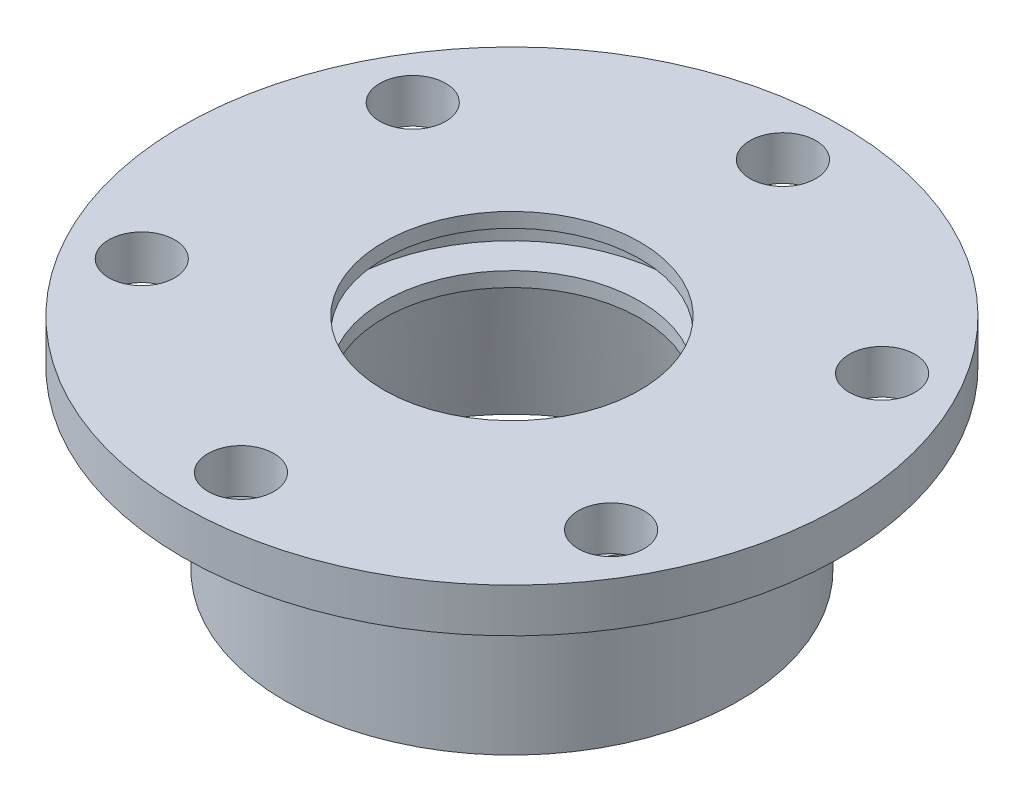
ISO-10303-21;
HEADER;
FILE_DESCRIPTION(('STEP AP214'),'2;1');
FILE_NAME('part.step','',(''),(''),'','','');
FILE_SCHEMA(('AUTOMOTIVE_DESIGN { 1 0 10303 214 1 1 1 1 }'));
ENDSEC;
DATA;
#1=APPLICATION_CONTEXT('core data for automotive mechanical design processes');
#2=APPLICATION_PROTOCOL_DEFINITION('international standard','automotive_design',2000,#1);
#3=PRODUCT_CONTEXT('',#1,'mechanical');
#4=PRODUCT('Part','Part','',(#3));
#5=PRODUCT_RELATED_PRODUCT_CATEGORY('part','',(#4));
#6=PRODUCT_DEFINITION_FORMATION('','',#4);
#7=PRODUCT_DEFINITION_CONTEXT('part definition',#1,'design');
#8=PRODUCT_DEFINITION('design','',#6,#7);
#9=PRODUCT_DEFINITION_SHAPE('','',#8);
#10=(LENGTH_UNIT() NAMED_UNIT(*) SI_UNIT(.MILLI.,.METRE.));
#11=(NAMED_UNIT(*) PLANE_ANGLE_UNIT() SI_UNIT($,.RADIAN.));
#12=(NAMED_UNIT(*) SI_UNIT($,.STERADIAN.) SOLID_ANGLE_UNIT());
#13=UNCERTAINTY_MEASURE_WITH_UNIT(LENGTH_MEASURE(1.E-05),#10,'distance_accuracy_value','');
#14=(GEOMETRIC_REPRESENTATION_CONTEXT(3) GLOBAL_UNCERTAINTY_ASSIGNED_CONTEXT((#13)) GLOBAL_UNIT_ASSIGNED_CONTEXT((#10,
#11,#12)) REPRESENTATION_CONTEXT('',''));
#15=CARTESIAN_POINT('',(0.,0.,0.));
#16=DIRECTION('',(0.,0.,1.));
#17=DIRECTION('',(1.,0.,0.));
#18=AXIS2_PLACEMENT_3D('',#15,#16,#17);
#19=CARTESIAN_POINT('',(-27.,30.,0.));
#20=DIRECTION('',(0.,1.,0.));
#21=DIRECTION('',(0.,0.,1.));
#22=AXIS2_PLACEMENT_3D('',#19,#20,#21);
#23=PLANE('',#22);
#24=CARTESIAN_POINT('',(0.,30.,-37.));
#25=DIRECTION('',(0.,1.,0.));
#26=DIRECTION('',(0.,0.,1.));
#27=AXIS2_PLACEMENT_3D('',#24,#25,#26);
#28=CIRCLE('',#27,4.5);
#29=CARTESIAN_POINT('',(0.,30.,-32.5));
#30=VERTEX_POINT('',#29);
#31=EDGE_CURVE('E79',#30,#30,#28,.T.);
#32=ORIENTED_EDGE('',*,*,#31,.F.);
#33=EDGE_LOOP('',(#32));
#34=FACE_BOUND('',#33,.T.);
#35=CARTESIAN_POINT('',(-32.0429399400232,30.,-18.4999999999982));
#36=DIRECTION('',(0.,1.,0.));
#37=DIRECTION('',(0.,0.,1.));
#38=AXIS2_PLACEMENT_3D('',#35,#36,#37);
#39=CIRCLE('',#38,4.50000000000197);
#40=CARTESIAN_POINT('',(-32.0429399400232,30.,-13.9999999999962));
#41=VERTEX_POINT('',#40);
#42=EDGE_CURVE('E84',#41,#41,#39,.T.);
#43=ORIENTED_EDGE('',*,*,#42,.F.);
#44=EDGE_LOOP('',(#43));
#45=FACE_BOUND('',#44,.T.);
#46=CARTESIAN_POINT('',(-32.0429399400211,30.,18.5000000000018));
#47=DIRECTION('',(0.,1.,0.));
#48=DIRECTION('',(0.,0.,1.));
#49=AXIS2_PLACEMENT_3D('',#46,#47,#48);
#50=CIRCLE('',#49,4.5000000000039);
#51=CARTESIAN_POINT('',(-32.0429399400211,30.,23.0000000000057));
#52=VERTEX_POINT('',#51);
#53=EDGE_CURVE('E83',#52,#52,#50,.T.);
#54=ORIENTED_EDGE('',*,*,#53,.F.);
#55=EDGE_LOOP('',(#54));
#56=FACE_BOUND('',#55,.T.);
#57=CARTESIAN_POINT('',(4.1990728836402E-12,30.,37.));
#58=DIRECTION('',(0.,1.,0.));
#59=DIRECTION('',(0.,0.,1.));
#60=AXIS2_PLACEMENT_3D('',#57,#58,#59);
#61=CIRCLE('',#60,4.50000000000426);
#62=CARTESIAN_POINT('',(4.1990728836402E-12,30.,41.5000000000043));
#63=VERTEX_POINT('',#62);
#64=EDGE_CURVE('E90',#63,#63,#61,.T.);
#65=ORIENTED_EDGE('',*,*,#64,.F.);
#66=EDGE_LOOP('',(#65));
#67=FACE_BOUND('',#66,.T.);
#68=CARTESIAN_POINT('',(32.0429399400274,30.,18.4999999999982));
#69=DIRECTION('',(0.,1.,0.));
#70=DIRECTION('',(0.,0.,1.));
#71=AXIS2_PLACEMENT_3D('',#68,#69,#70);
#72=CIRCLE('',#71,4.50000000000265);
#73=CARTESIAN_POINT('',(32.0429399400274,30.,23.0000000000008));
#74=VERTEX_POINT('',#73);
#75=EDGE_CURVE('E96',#74,#74,#72,.T.);
#76=ORIENTED_EDGE('',*,*,#75,.F.);
#77=EDGE_LOOP('',(#76));
#78=FACE_BOUND('',#77,.T.);
#79=CARTESIAN_POINT('',(32.0429399400253,30.,-18.5000000000018));
#80=DIRECTION('',(0.,1.,0.));
#81=DIRECTION('',(0.,0.,1.));
#82=AXIS2_PLACEMENT_3D('',#79,#80,#81);
#83=CIRCLE('',#82,4.50000000000057);
#84=CARTESIAN_POINT('',(32.0429399400253,30.,-14.0000000000013));
#85=VERTEX_POINT('',#84);
#86=EDGE_CURVE('E102',#85,#85,#83,.T.);
#87=ORIENTED_EDGE('',*,*,#86,.F.);
#88=EDGE_LOOP('',(#87));
#89=FACE_BOUND('',#88,.T.);
#90=CARTESIAN_POINT('',(0.,30.,0.));
#91=DIRECTION('',(0.,1.,0.));
#92=DIRECTION('',(0.,0.,1.));
#93=AXIS2_PLACEMENT_3D('',#90,#91,#92);
#94=CIRCLE('',#93,45.);
#95=CARTESIAN_POINT('',(0.,30.,45.));
#96=VERTEX_POINT('',#95);
#97=EDGE_CURVE('E76',#96,#96,#94,.T.);
#98=ORIENTED_EDGE('',*,*,#97,.T.);
#99=EDGE_LOOP('',(#98));
#100=FACE_BOUND('',#99,.T.);
#101=CARTESIAN_POINT('',(0.,30.,0.));
#102=DIRECTION('',(0.,1.,0.));
#103=DIRECTION('',(0.,0.,1.));
#104=AXIS2_PLACEMENT_3D('',#101,#102,#103);
#105=CIRCLE('',#104,17.5);
#106=CARTESIAN_POINT('',(0.,30.,17.5));
#107=VERTEX_POINT('',#106);
#108=EDGE_CURVE('E10',#107,#107,#105,.T.);
#109=ORIENTED_EDGE('',*,*,#108,.F.);
#110=EDGE_LOOP('',(#109));
#111=FACE_BOUND('',#110,.T.);
#112=ADVANCED_FACE('F30',(#34,#45,#56,#67,#78,#89,#100,#111),#23,.T.);
#113=CARTESIAN_POINT('',(0.,30.6187975640425,0.));
#114=DIRECTION('',(0.,1.,0.));
#115=DIRECTION('',(0.,0.,1.));
#116=AXIS2_PLACEMENT_3D('',#113,#114,#115);
#117=CYLINDRICAL_SURFACE('',#116,17.5);
#118=ORIENTED_EDGE('',*,*,#108,.T.);
#119=EDGE_LOOP('',(#118));
#120=FACE_BOUND('',#119,.T.);
#121=CARTESIAN_POINT('',(0.,28.,0.));
#122=DIRECTION('',(0.,1.,0.));
#123=DIRECTION('',(0.,0.,1.));
#124=AXIS2_PLACEMENT_3D('',#121,#122,#123);
#125=CIRCLE('',#124,17.5);
#126=CARTESIAN_POINT('',(0.,28.,17.5));
#127=VERTEX_POINT('',#126);
#128=EDGE_CURVE('E36',#127,#127,#125,.T.);
#129=ORIENTED_EDGE('',*,*,#128,.F.);
#130=EDGE_LOOP('',(#129));
#131=FACE_BOUND('',#130,.T.);
#132=ADVANCED_FACE('F120',(#120,#131),#117,.F.);
#133=CARTESIAN_POINT('',(-17.5,28.,0.));
#134=DIRECTION('',(0.,-1.,0.));
#135=DIRECTION('',(0.,0.,-1.));
#136=AXIS2_PLACEMENT_3D('',#133,#134,#135);
#137=PLANE('',#136);
#138=ORIENTED_EDGE('',*,*,#128,.T.);
#139=EDGE_LOOP('',(#138));
#140=FACE_BOUND('',#139,.T.);
#141=CARTESIAN_POINT('',(0.,28.,0.));
#142=DIRECTION('',(0.,1.,0.));
#143=DIRECTION('',(0.,0.,1.));
#144=AXIS2_PLACEMENT_3D('',#141,#142,#143);
#145=CIRCLE('',#144,22.5);
#146=CARTESIAN_POINT('',(0.,28.,22.5));
#147=VERTEX_POINT('',#146);
#148=EDGE_CURVE('E40',#147,#147,#145,.T.);
#149=ORIENTED_EDGE('',*,*,#148,.F.);
#150=EDGE_LOOP('',(#149));
#151=FACE_BOUND('',#150,.T.);
#152=ADVANCED_FACE('F188',(#140,#151),#137,.T.);
#153=CARTESIAN_POINT('',(0.,30.6187975640425,0.));
#154=DIRECTION('',(0.,1.,0.));
#155=DIRECTION('',(0.,0.,1.));
#156=AXIS2_PLACEMENT_3D('',#153,#154,#155);
#157=CYLINDRICAL_SURFACE('',#156,22.5);
#158=ORIENTED_EDGE('',*,*,#148,.T.);
#159=EDGE_LOOP('',(#158));
#160=FACE_BOUND('',#159,.T.);
#161=CARTESIAN_POINT('',(0.,23.,0.));
#162=DIRECTION('',(0.,1.,0.));
#163=DIRECTION('',(0.,0.,1.));
#164=AXIS2_PLACEMENT_3D('',#161,#162,#163);
#165=CIRCLE('',#164,22.5);
#166=CARTESIAN_POINT('',(0.,23.,22.5));
#167=VERTEX_POINT('',#166);
#168=EDGE_CURVE('E44',#167,#167,#165,.T.);
#169=ORIENTED_EDGE('',*,*,#168,.F.);
#170=EDGE_LOOP('',(#169));
#171=FACE_BOUND('',#170,.T.);
#172=ADVANCED_FACE('F184',(#160,#171),#157,.F.);
#173=CARTESIAN_POINT('',(-22.5,23.,0.));
#174=DIRECTION('',(0.,1.,0.));
#175=DIRECTION('',(0.,0.,1.));
#176=AXIS2_PLACEMENT_3D('',#173,#174,#175);
#177=PLANE('',#176);
#178=ORIENTED_EDGE('',*,*,#168,.T.);
#179=EDGE_LOOP('',(#178));
#180=FACE_BOUND('',#179,.T.);
#181=CARTESIAN_POINT('',(0.,23.,0.));
#182=DIRECTION('',(0.,1.,0.));
#183=DIRECTION('',(0.,0.,1.));
#184=AXIS2_PLACEMENT_3D('',#181,#182,#183);
#185=CIRCLE('',#184,17.5);
#186=CARTESIAN_POINT('',(0.,23.,17.5));
#187=VERTEX_POINT('',#186);
#188=EDGE_CURVE('E49',#187,#187,#185,.T.);
#189=ORIENTED_EDGE('',*,*,#188,.F.);
#190=EDGE_LOOP('',(#189));
#191=FACE_BOUND('',#190,.T.);
#192=ADVANCED_FACE('F180',(#180,#191),#177,.T.);
#193=CARTESIAN_POINT('',(0.,30.6187975640425,0.));
#194=DIRECTION('',(0.,1.,0.));
#195=DIRECTION('',(0.,0.,1.));
#196=AXIS2_PLACEMENT_3D('',#193,#194,#195);
#197=CYLINDRICAL_SURFACE('',#196,17.5);
#198=ORIENTED_EDGE('',*,*,#188,.T.);
#199=EDGE_LOOP('',(#198));
#200=FACE_BOUND('',#199,.T.);
#201=CARTESIAN_POINT('',(0.,21.,0.));
#202=DIRECTION('',(0.,1.,0.));
#203=DIRECTION('',(0.,0.,1.));
#204=AXIS2_PLACEMENT_3D('',#201,#202,#203);
#205=CIRCLE('',#204,17.5);
#206=CARTESIAN_POINT('',(0.,21.,17.5));
#207=VERTEX_POINT('',#206);
#208=EDGE_CURVE('E52',#207,#207,#205,.T.);
#209=ORIENTED_EDGE('',*,*,#208,.F.);
#210=EDGE_LOOP('',(#209));
#211=FACE_BOUND('',#210,.T.);
#212=ADVANCED_FACE('F176',(#200,#211),#197,.F.);
#213=CARTESIAN_POINT('',(-17.5,21.,0.));
#214=DIRECTION('',(0.,-1.,0.));
#215=DIRECTION('',(0.,0.,-1.));
#216=AXIS2_PLACEMENT_3D('',#213,#214,#215);
#217=PLANE('',#216);
#218=ORIENTED_EDGE('',*,*,#208,.T.);
#219=EDGE_LOOP('',(#218));
#220=FACE_BOUND('',#219,.T.);
#221=CARTESIAN_POINT('',(0.,21.,0.));
#222=DIRECTION('',(0.,1.,0.));
#223=DIRECTION('',(0.,0.,1.));
#224=AXIS2_PLACEMENT_3D('',#221,#222,#223);
#225=CIRCLE('',#224,22.2971334051223);
#226=CARTESIAN_POINT('',(0.,21.,22.2971334051223));
#227=VERTEX_POINT('',#226);
#228=EDGE_CURVE('E55',#227,#227,#225,.T.);
#229=ORIENTED_EDGE('',*,*,#228,.F.);
#230=EDGE_LOOP('',(#229));
#231=FACE_BOUND('',#230,.T.);
#232=ADVANCED_FACE('F172',(#220,#231),#217,.T.);
#233=CARTESIAN_POINT('',(0.,0.,0.));
#234=DIRECTION('',(0.,-1.,0.));
#235=DIRECTION('',(0.,0.,-1.));
#236=AXIS2_PLACEMENT_3D('',#233,#234,#235);
#237=CONICAL_SURFACE('',#236,26.,0.174532925199429);
#238=ORIENTED_EDGE('',*,*,#228,.T.);
#239=EDGE_LOOP('',(#238));
#240=FACE_BOUND('',#239,.T.);
#241=CARTESIAN_POINT('',(0.,0.,0.));
#242=DIRECTION('',(0.,1.,0.));
#243=DIRECTION('',(0.,0.,1.));
#244=AXIS2_PLACEMENT_3D('',#241,#242,#243);
#245=CIRCLE('',#244,26.);
#246=CARTESIAN_POINT('',(0.,0.,26.));
#247=VERTEX_POINT('',#246);
#248=EDGE_CURVE('E58',#247,#247,#245,.T.);
#249=ORIENTED_EDGE('',*,*,#248,.F.);
#250=EDGE_LOOP('',(#249));
#251=FACE_BOUND('',#250,.T.);
#252=ADVANCED_FACE('F168',(#240,#251),#237,.F.);
#253=CARTESIAN_POINT('',(-31.,0.,0.));
#254=DIRECTION('',(0.,-1.,0.));
#255=DIRECTION('',(0.,0.,-1.));
#256=AXIS2_PLACEMENT_3D('',#253,#254,#255);
#257=PLANE('',#256);
#258=ORIENTED_EDGE('',*,*,#248,.T.);
#259=EDGE_LOOP('',(#258));
#260=FACE_BOUND('',#259,.T.);
#261=CARTESIAN_POINT('',(0.,0.,0.));
#262=DIRECTION('',(0.,1.,0.));
#263=DIRECTION('',(0.,0.,1.));
#264=AXIS2_PLACEMENT_3D('',#261,#262,#263);
#265=CIRCLE('',#264,31.);
#266=CARTESIAN_POINT('',(0.,0.,31.));
#267=VERTEX_POINT('',#266);
#268=EDGE_CURVE('E61',#267,#267,#265,.T.);
#269=ORIENTED_EDGE('',*,*,#268,.F.);
#270=EDGE_LOOP('',(#269));
#271=FACE_BOUND('',#270,.T.);
#272=ADVANCED_FACE('F164',(#260,#271),#257,.T.);
#273=CARTESIAN_POINT('',(0.,30.6187975640425,0.));
#274=DIRECTION('',(0.,1.,0.));
#275=DIRECTION('',(0.,0.,1.));
#276=AXIS2_PLACEMENT_3D('',#273,#274,#275);
#277=CYLINDRICAL_SURFACE('',#276,31.);
#278=ORIENTED_EDGE('',*,*,#268,.T.);
#279=EDGE_LOOP('',(#278));
#280=FACE_BOUND('',#279,.T.);
#281=CARTESIAN_POINT('',(0.,22.5,0.));
#282=DIRECTION('',(0.,1.,0.));
#283=DIRECTION('',(0.,0.,1.));
#284=AXIS2_PLACEMENT_3D('',#281,#282,#283);
#285=CIRCLE('',#284,31.);
#286=CARTESIAN_POINT('',(0.,22.5,31.));
#287=VERTEX_POINT('',#286);
#288=EDGE_CURVE('E64',#287,#287,#285,.T.);
#289=ORIENTED_EDGE('',*,*,#288,.F.);
#290=EDGE_LOOP('',(#289));
#291=FACE_BOUND('',#290,.T.);
#292=ADVANCED_FACE('F160',(#280,#291),#277,.T.);
#293=CARTESIAN_POINT('',(-29.5,22.5,0.));
#294=DIRECTION('',(0.,1.,0.));
#295=DIRECTION('',(0.,0.,1.));
#296=AXIS2_PLACEMENT_3D('',#293,#294,#295);
#297=PLANE('',#296);
#298=ORIENTED_EDGE('',*,*,#288,.T.);
#299=EDGE_LOOP('',(#298));
#300=FACE_BOUND('',#299,.T.);
#301=CARTESIAN_POINT('',(0.,22.5,0.));
#302=DIRECTION('',(0.,1.,0.));
#303=DIRECTION('',(0.,0.,1.));
#304=AXIS2_PLACEMENT_3D('',#301,#302,#303);
#305=CIRCLE('',#304,29.5);
#306=CARTESIAN_POINT('',(0.,22.5,29.5));
#307=VERTEX_POINT('',#306);
#308=EDGE_CURVE('E67',#307,#307,#305,.T.);
#309=ORIENTED_EDGE('',*,*,#308,.F.);
#310=EDGE_LOOP('',(#309));
#311=FACE_BOUND('',#310,.T.);
#312=ADVANCED_FACE('F156',(#300,#311),#297,.T.);
#313=CARTESIAN_POINT('',(0.,30.6187975640425,0.));
#314=DIRECTION('',(0.,1.,0.));
#315=DIRECTION('',(0.,0.,1.));
#316=AXIS2_PLACEMENT_3D('',#313,#314,#315);
#317=CYLINDRICAL_SURFACE('',#316,29.5);
#318=ORIENTED_EDGE('',*,*,#308,.T.);
#319=EDGE_LOOP('',(#318));
#320=FACE_BOUND('',#319,.T.);
#321=CARTESIAN_POINT('',(0.,24.,0.));
#322=DIRECTION('',(0.,1.,0.));
#323=DIRECTION('',(0.,0.,1.));
#324=AXIS2_PLACEMENT_3D('',#321,#322,#323);
#325=CIRCLE('',#324,29.5);
#326=CARTESIAN_POINT('',(0.,24.,29.5));
#327=VERTEX_POINT('',#326);
#328=EDGE_CURVE('E70',#327,#327,#325,.T.);
#329=ORIENTED_EDGE('',*,*,#328,.F.);
#330=EDGE_LOOP('',(#329));
#331=FACE_BOUND('',#330,.T.);
#332=ADVANCED_FACE('F147',(#320,#331),#317,.T.);
#333=CARTESIAN_POINT('',(-45.,24.,0.));
#334=DIRECTION('',(0.,-1.,0.));
#335=DIRECTION('',(0.,0.,-1.));
#336=AXIS2_PLACEMENT_3D('',#333,#334,#335);
#337=PLANE('',#336);
#338=CARTESIAN_POINT('',(0.,24.,-37.));
#339=DIRECTION('',(0.,-1.,0.));
#340=DIRECTION('',(0.,0.,-1.));
#341=AXIS2_PLACEMENT_3D('',#338,#339,#340);
#342=CIRCLE('',#341,4.5);
#343=CARTESIAN_POINT('',(0.,24.,-41.5));
#344=VERTEX_POINT('',#343);
#345=EDGE_CURVE('E105',#344,#344,#342,.F.);
#346=ORIENTED_EDGE('',*,*,#345,.T.);
#347=EDGE_LOOP('',(#346));
#348=FACE_BOUND('',#347,.T.);
#349=CARTESIAN_POINT('',(-32.0429399400232,24.,-18.4999999999982));
#350=DIRECTION('',(0.,-1.,0.));
#351=DIRECTION('',(0.,0.,-1.));
#352=AXIS2_PLACEMENT_3D('',#349,#350,#351);
#353=CIRCLE('',#352,4.50000000000197);
#354=CARTESIAN_POINT('',(-32.0429399400232,24.,-23.0000000000001));
#355=VERTEX_POINT('',#354);
#356=EDGE_CURVE('E106',#355,#355,#353,.F.);
#357=ORIENTED_EDGE('',*,*,#356,.T.);
#358=EDGE_LOOP('',(#357));
#359=FACE_BOUND('',#358,.T.);
#360=CARTESIAN_POINT('',(-32.0429399400211,24.,18.5000000000018));
#361=DIRECTION('',(0.,-1.,0.));
#362=DIRECTION('',(0.,0.,-1.));
#363=AXIS2_PLACEMENT_3D('',#360,#361,#362);
#364=CIRCLE('',#363,4.5000000000039);
#365=CARTESIAN_POINT('',(-32.0429399400211,24.,13.9999999999979));
#366=VERTEX_POINT('',#365);
#367=EDGE_CURVE('E80',#366,#366,#364,.F.);
#368=ORIENTED_EDGE('',*,*,#367,.T.);
#369=EDGE_LOOP('',(#368));
#370=FACE_BOUND('',#369,.T.);
#371=CARTESIAN_POINT('',(4.1990728836402E-12,24.,37.));
#372=DIRECTION('',(0.,-1.,0.));
#373=DIRECTION('',(0.,0.,-1.));
#374=AXIS2_PLACEMENT_3D('',#371,#372,#373);
#375=CIRCLE('',#374,4.50000000000426);
#376=CARTESIAN_POINT('',(4.1990728836402E-12,24.,32.4999999999957));
#377=VERTEX_POINT('',#376);
#378=EDGE_CURVE('E87',#377,#377,#375,.F.);
#379=ORIENTED_EDGE('',*,*,#378,.T.);
#380=EDGE_LOOP('',(#379));
#381=FACE_BOUND('',#380,.T.);
#382=CARTESIAN_POINT('',(32.0429399400274,24.,18.4999999999982));
#383=DIRECTION('',(0.,-1.,0.));
#384=DIRECTION('',(0.,0.,-1.));
#385=AXIS2_PLACEMENT_3D('',#382,#383,#384);
#386=CIRCLE('',#385,4.50000000000265);
#387=CARTESIAN_POINT('',(32.0429399400274,24.,13.9999999999955));
#388=VERTEX_POINT('',#387);
#389=EDGE_CURVE('E93',#388,#388,#386,.F.);
#390=ORIENTED_EDGE('',*,*,#389,.T.);
#391=EDGE_LOOP('',(#390));
#392=FACE_BOUND('',#391,.T.);
#393=CARTESIAN_POINT('',(32.0429399400253,24.,-18.5000000000018));
#394=DIRECTION('',(0.,-1.,0.));
#395=DIRECTION('',(0.,0.,-1.));
#396=AXIS2_PLACEMENT_3D('',#393,#394,#395);
#397=CIRCLE('',#396,4.50000000000057);
#398=CARTESIAN_POINT('',(32.0429399400253,24.,-23.0000000000024));
#399=VERTEX_POINT('',#398);
#400=EDGE_CURVE('E99',#399,#399,#397,.F.);
#401=ORIENTED_EDGE('',*,*,#400,.T.);
#402=EDGE_LOOP('',(#401));
#403=FACE_BOUND('',#402,.T.);
#404=ORIENTED_EDGE('',*,*,#328,.T.);
#405=EDGE_LOOP('',(#404));
#406=FACE_BOUND('',#405,.T.);
#407=CARTESIAN_POINT('',(0.,24.,0.));
#408=DIRECTION('',(0.,1.,0.));
#409=DIRECTION('',(0.,0.,1.));
#410=AXIS2_PLACEMENT_3D('',#407,#408,#409);
#411=CIRCLE('',#410,45.);
#412=CARTESIAN_POINT('',(0.,24.,45.));
#413=VERTEX_POINT('',#412);
#414=EDGE_CURVE('E73',#413,#413,#411,.T.);
#415=ORIENTED_EDGE('',*,*,#414,.F.);
#416=EDGE_LOOP('',(#415));
#417=FACE_BOUND('',#416,.T.);
#418=ADVANCED_FACE('F137',(#348,#359,#370,#381,#392,#403,#406,#417),#337,.T.);
#419=CARTESIAN_POINT('',(0.,30.6187975640425,0.));
#420=DIRECTION('',(0.,1.,0.));
#421=DIRECTION('',(0.,0.,1.));
#422=AXIS2_PLACEMENT_3D('',#419,#420,#421);
#423=CYLINDRICAL_SURFACE('',#422,45.);
#424=ORIENTED_EDGE('',*,*,#414,.T.);
#425=EDGE_LOOP('',(#424));
#426=FACE_BOUND('',#425,.T.);
#427=ORIENTED_EDGE('',*,*,#97,.F.);
#428=EDGE_LOOP('',(#427));
#429=FACE_BOUND('',#428,.T.);
#430=ADVANCED_FACE('F134',(#426,#429),#423,.T.);
#431=CARTESIAN_POINT('',(32.0429399400253,-0.001000000000001,-18.5000000000018));
#432=DIRECTION('',(0.,1.,0.));
#433=DIRECTION('',(0.,0.,1.));
#434=AXIS2_PLACEMENT_3D('',#431,#432,#433);
#435=CYLINDRICAL_SURFACE('',#434,4.50000000000057);
#436=ORIENTED_EDGE('',*,*,#400,.F.);
#437=EDGE_LOOP('',(#436));
#438=FACE_BOUND('',#437,.T.);
#439=ORIENTED_EDGE('',*,*,#86,.T.);
#440=EDGE_LOOP('',(#439));
#441=FACE_BOUND('',#440,.T.);
#442=ADVANCED_FACE('F136',(#438,#441),#435,.F.);
#443=CARTESIAN_POINT('',(32.0429399400274,-0.001000000000001,18.4999999999982));
#444=DIRECTION('',(0.,1.,0.));
#445=DIRECTION('',(0.,0.,1.));
#446=AXIS2_PLACEMENT_3D('',#443,#444,#445);
#447=CYLINDRICAL_SURFACE('',#446,4.50000000000265);
#448=ORIENTED_EDGE('',*,*,#389,.F.);
#449=EDGE_LOOP('',(#448));
#450=FACE_BOUND('',#449,.T.);
#451=ORIENTED_EDGE('',*,*,#75,.T.);
#452=EDGE_LOOP('',(#451));
#453=FACE_BOUND('',#452,.T.);
#454=ADVANCED_FACE('F144',(#450,#453),#447,.F.);
#455=CARTESIAN_POINT('',(4.1990728836402E-12,-0.001000000000001,37.));
#456=DIRECTION('',(0.,1.,0.));
#457=DIRECTION('',(0.,0.,1.));
#458=AXIS2_PLACEMENT_3D('',#455,#456,#457);
#459=CYLINDRICAL_SURFACE('',#458,4.50000000000426);
#460=ORIENTED_EDGE('',*,*,#378,.F.);
#461=EDGE_LOOP('',(#460));
#462=FACE_BOUND('',#461,.T.);
#463=ORIENTED_EDGE('',*,*,#64,.T.);
#464=EDGE_LOOP('',(#463));
#465=FACE_BOUND('',#464,.T.);
#466=ADVANCED_FACE('F259',(#462,#465),#459,.F.);
#467=CARTESIAN_POINT('',(-32.0429399400211,-0.001000000000001,18.5000000000018));
#468=DIRECTION('',(0.,1.,0.));
#469=DIRECTION('',(0.,0.,1.));
#470=AXIS2_PLACEMENT_3D('',#467,#468,#469);
#471=CYLINDRICAL_SURFACE('',#470,4.5000000000039);
#472=ORIENTED_EDGE('',*,*,#367,.F.);
#473=EDGE_LOOP('',(#472));
#474=FACE_BOUND('',#473,.T.);
#475=ORIENTED_EDGE('',*,*,#53,.T.);
#476=EDGE_LOOP('',(#475));
#477=FACE_BOUND('',#476,.T.);
#478=ADVANCED_FACE('F151',(#474,#477),#471,.F.);
#479=CARTESIAN_POINT('',(-32.0429399400232,-0.001000000000001,-18.4999999999982));
#480=DIRECTION('',(0.,1.,0.));
#481=DIRECTION('',(0.,0.,1.));
#482=AXIS2_PLACEMENT_3D('',#479,#480,#481);
#483=CYLINDRICAL_SURFACE('',#482,4.50000000000197);
#484=ORIENTED_EDGE('',*,*,#356,.F.);
#485=EDGE_LOOP('',(#484));
#486=FACE_BOUND('',#485,.T.);
#487=ORIENTED_EDGE('',*,*,#42,.T.);
#488=EDGE_LOOP('',(#487));
#489=FACE_BOUND('',#488,.T.);
#490=ADVANCED_FACE('F277',(#486,#489),#483,.F.);
#491=CARTESIAN_POINT('',(0.,-0.001000000000001,-37.));
#492=DIRECTION('',(0.,1.,0.));
#493=DIRECTION('',(0.,0.,1.));
#494=AXIS2_PLACEMENT_3D('',#491,#492,#493);
#495=CYLINDRICAL_SURFACE('',#494,4.5);
#496=ORIENTED_EDGE('',*,*,#345,.F.);
#497=EDGE_LOOP('',(#496));
#498=FACE_BOUND('',#497,.T.);
#499=ORIENTED_EDGE('',*,*,#31,.T.);
#500=EDGE_LOOP('',(#499));
#501=FACE_BOUND('',#500,.T.);
#502=ADVANCED_FACE('F116',(#498,#501),#495,.F.);
#503=CLOSED_SHELL('',(#112,#132,#152,#172,#192,#212,#232,#252,#272,#292,#312,#332,#418,#430,
#442,#454,#466,#478,#490,#502));
#504=MANIFOLD_SOLID_BREP('B2',#503);
#505=ADVANCED_BREP_SHAPE_REPRESENTATION('',(#18,#504),#14);
#506=SHAPE_DEFINITION_REPRESENTATION(#9,#505);
ENDSEC;
END-ISO-10303-21;
